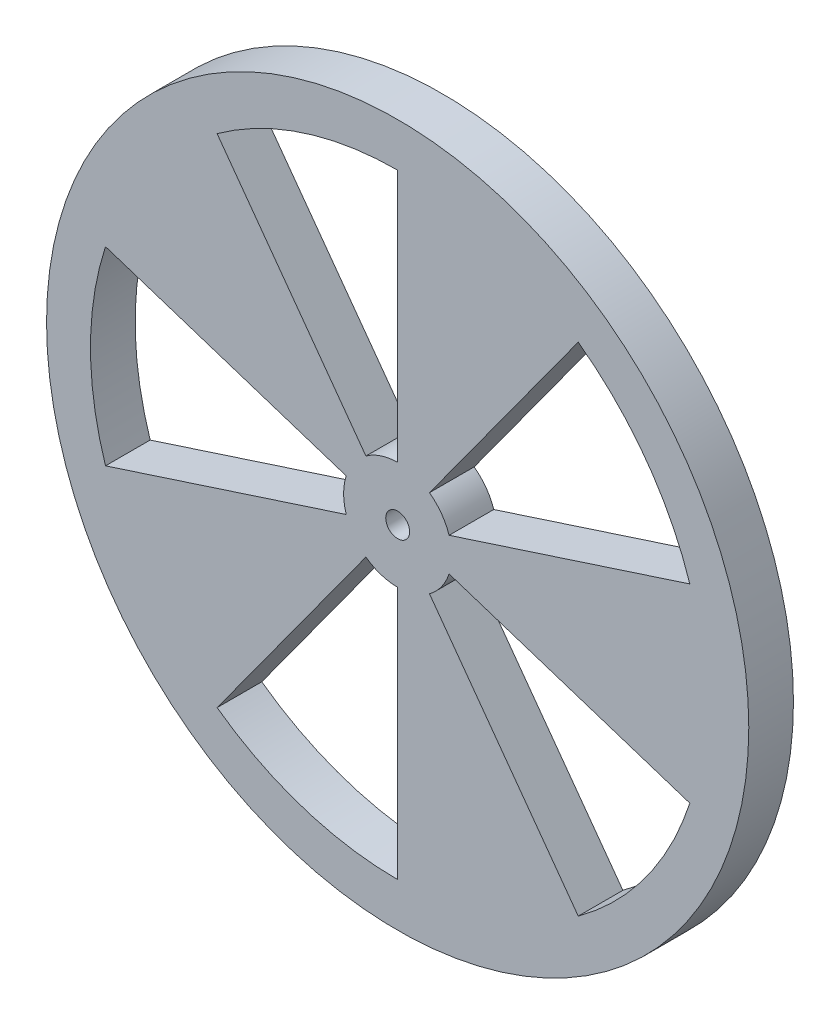
ISO-10303-21;
HEADER;
FILE_DESCRIPTION(('STEP AP214'),'2;1');
FILE_NAME('part.step','',(''),(''),'','','');
FILE_SCHEMA(('AUTOMOTIVE_DESIGN { 1 0 10303 214 1 1 1 1 }'));
ENDSEC;
DATA;
#1=APPLICATION_CONTEXT('core data for automotive mechanical design processes');
#2=APPLICATION_PROTOCOL_DEFINITION('international standard','automotive_design',2000,#1);
#3=PRODUCT_CONTEXT('',#1,'mechanical');
#4=PRODUCT('Part','Part','',(#3));
#5=PRODUCT_RELATED_PRODUCT_CATEGORY('part','',(#4));
#6=PRODUCT_DEFINITION_FORMATION('','',#4);
#7=PRODUCT_DEFINITION_CONTEXT('part definition',#1,'design');
#8=PRODUCT_DEFINITION('design','',#6,#7);
#9=PRODUCT_DEFINITION_SHAPE('','',#8);
#10=(LENGTH_UNIT() NAMED_UNIT(*) SI_UNIT(.MILLI.,.METRE.));
#11=(NAMED_UNIT(*) PLANE_ANGLE_UNIT() SI_UNIT($,.RADIAN.));
#12=(NAMED_UNIT(*) SI_UNIT($,.STERADIAN.) SOLID_ANGLE_UNIT());
#13=UNCERTAINTY_MEASURE_WITH_UNIT(LENGTH_MEASURE(1.E-05),#10,'distance_accuracy_value','');
#14=(GEOMETRIC_REPRESENTATION_CONTEXT(3) GLOBAL_UNCERTAINTY_ASSIGNED_CONTEXT((#13)) GLOBAL_UNIT_ASSIGNED_CONTEXT((#10,
#11,#12)) REPRESENTATION_CONTEXT('',''));
#15=CARTESIAN_POINT('',(0.,0.,0.));
#16=DIRECTION('',(0.,0.,1.));
#17=DIRECTION('',(1.,0.,0.));
#18=AXIS2_PLACEMENT_3D('',#15,#16,#17);
#19=CARTESIAN_POINT('',(0.,0.,3.18));
#20=DIRECTION('',(0.,0.,1.));
#21=DIRECTION('',(1.,0.,0.));
#22=AXIS2_PLACEMENT_3D('',#19,#20,#21);
#23=PLANE('',#22);
#24=DIRECTION('',(0.951056516295154,0.309016994374948,0.));
#25=VECTOR('',#24,1.);
#26=CARTESIAN_POINT('',(0.,0.,3.18));
#27=LINE('',#26,#25);
#28=CARTESIAN_POINT('',(3.66156758773635,1.18971542834355,3.18));
#29=VERTEX_POINT('',#28);
#30=CARTESIAN_POINT('',(20.8013341471714,6.75876317233811,3.18));
#31=VERTEX_POINT('',#30);
#32=EDGE_CURVE('E112',#29,#31,#27,.T.);
#33=ORIENTED_EDGE('',*,*,#32,.F.);
#34=CARTESIAN_POINT('',(0.,0.,3.18));
#35=DIRECTION('',(0.,0.,1.));
#36=DIRECTION('',(1.,0.,0.));
#37=AXIS2_PLACEMENT_3D('',#34,#35,#36);
#38=CIRCLE('',#37,3.85);
#39=CARTESIAN_POINT('',(2.26297322132602,3.11471542834354,3.18));
#40=VERTEX_POINT('',#39);
#41=EDGE_CURVE('E342',#29,#40,#38,.T.);
#42=ORIENTED_EDGE('',*,*,#41,.T.);
#43=DIRECTION('',(0.587785252292473,0.809016994374948,0.));
#44=VECTOR('',#43,1.);
#45=CARTESIAN_POINT('',(0.,0.,3.18));
#46=LINE('',#45,#44);
#47=CARTESIAN_POINT('',(12.8559315142957,17.6946717070922,3.18));
#48=VERTEX_POINT('',#47);
#49=EDGE_CURVE('E355',#40,#48,#46,.T.);
#50=ORIENTED_EDGE('',*,*,#49,.T.);
#51=CARTESIAN_POINT('',(0.,0.,3.18));
#52=DIRECTION('',(0.,0.,1.));
#53=DIRECTION('',(1.,0.,0.));
#54=AXIS2_PLACEMENT_3D('',#51,#52,#53);
#55=CIRCLE('',#54,21.8718170695083);
#56=EDGE_CURVE('E352',#31,#48,#55,.T.);
#57=ORIENTED_EDGE('',*,*,#56,.F.);
#58=EDGE_LOOP('',(#33,#42,#50,#57));
#59=FACE_BOUND('',#58,.T.);
#60=DIRECTION('',(0.587785252292473,-0.809016994374947,0.));
#61=VECTOR('',#60,1.);
#62=CARTESIAN_POINT('',(0.,0.,3.18));
#63=LINE('',#62,#61);
#64=CARTESIAN_POINT('',(2.26297322132602,-3.11471542834355,3.18));
#65=VERTEX_POINT('',#64);
#66=CARTESIAN_POINT('',(12.8559315142957,-17.6946717070922,3.18));
#67=VERTEX_POINT('',#66);
#68=EDGE_CURVE('E120',#65,#67,#63,.T.);
#69=ORIENTED_EDGE('',*,*,#68,.F.);
#70=CARTESIAN_POINT('',(0.,0.,3.18));
#71=DIRECTION('',(0.,0.,1.));
#72=DIRECTION('',(1.,0.,0.));
#73=AXIS2_PLACEMENT_3D('',#70,#71,#72);
#74=CIRCLE('',#73,3.85);
#75=CARTESIAN_POINT('',(3.66156758773634,-1.18971542834355,3.18));
#76=VERTEX_POINT('',#75);
#77=EDGE_CURVE('E313',#65,#76,#74,.T.);
#78=ORIENTED_EDGE('',*,*,#77,.T.);
#79=DIRECTION('',(0.951056516295154,-0.309016994374947,0.));
#80=VECTOR('',#79,1.);
#81=CARTESIAN_POINT('',(0.,0.,3.18));
#82=LINE('',#81,#80);
#83=CARTESIAN_POINT('',(20.8013341471714,-6.75876317233811,3.18));
#84=VERTEX_POINT('',#83);
#85=EDGE_CURVE('E327',#76,#84,#82,.T.);
#86=ORIENTED_EDGE('',*,*,#85,.T.);
#87=CARTESIAN_POINT('',(0.,0.,3.18));
#88=DIRECTION('',(0.,0.,1.));
#89=DIRECTION('',(1.,0.,0.));
#90=AXIS2_PLACEMENT_3D('',#87,#88,#89);
#91=CIRCLE('',#90,21.8718170695083);
#92=EDGE_CURVE('E323',#67,#84,#91,.T.);
#93=ORIENTED_EDGE('',*,*,#92,.F.);
#94=EDGE_LOOP('',(#69,#78,#86,#93));
#95=FACE_BOUND('',#94,.T.);
#96=DIRECTION('',(-0.951056516295154,0.309016994374947,0.));
#97=VECTOR('',#96,1.);
#98=CARTESIAN_POINT('',(0.,0.,3.18));
#99=LINE('',#98,#97);
#100=CARTESIAN_POINT('',(-3.66156758773635,1.18971542834355,3.18));
#101=VERTEX_POINT('',#100);
#102=CARTESIAN_POINT('',(-20.8013341471714,6.75876317233811,3.18));
#103=VERTEX_POINT('',#102);
#104=EDGE_CURVE('E274',#101,#103,#99,.T.);
#105=ORIENTED_EDGE('',*,*,#104,.F.);
#106=CARTESIAN_POINT('',(0.,0.,3.18));
#107=DIRECTION('',(0.,0.,1.));
#108=DIRECTION('',(1.,0.,0.));
#109=AXIS2_PLACEMENT_3D('',#106,#107,#108);
#110=CIRCLE('',#109,3.85);
#111=CARTESIAN_POINT('',(-3.66156758773634,-1.18971542834355,3.18));
#112=VERTEX_POINT('',#111);
#113=EDGE_CURVE('E282',#101,#112,#110,.T.);
#114=ORIENTED_EDGE('',*,*,#113,.T.);
#115=DIRECTION('',(-0.951056516295154,-0.309016994374948,0.));
#116=VECTOR('',#115,1.);
#117=CARTESIAN_POINT('',(0.,0.,3.18));
#118=LINE('',#117,#116);
#119=CARTESIAN_POINT('',(-20.8013341471714,-6.75876317233811,3.18));
#120=VERTEX_POINT('',#119);
#121=EDGE_CURVE('E295',#112,#120,#118,.T.);
#122=ORIENTED_EDGE('',*,*,#121,.T.);
#123=CARTESIAN_POINT('',(0.,0.,3.18));
#124=DIRECTION('',(0.,0.,1.));
#125=DIRECTION('',(1.,0.,0.));
#126=AXIS2_PLACEMENT_3D('',#123,#124,#125);
#127=CIRCLE('',#126,21.8718170695083);
#128=EDGE_CURVE('E292',#103,#120,#127,.T.);
#129=ORIENTED_EDGE('',*,*,#128,.F.);
#130=EDGE_LOOP('',(#105,#114,#122,#129));
#131=FACE_BOUND('',#130,.T.);
#132=DIRECTION('',(-0.587785252292473,-0.809016994374947,0.));
#133=VECTOR('',#132,1.);
#134=CARTESIAN_POINT('',(0.,0.,3.18));
#135=LINE('',#134,#133);
#136=CARTESIAN_POINT('',(-2.26297322132602,-3.11471542834355,3.18));
#137=VERTEX_POINT('',#136);
#138=CARTESIAN_POINT('',(-12.8559315142957,-17.6946717070922,3.18));
#139=VERTEX_POINT('',#138);
#140=EDGE_CURVE('E241',#137,#139,#135,.T.);
#141=ORIENTED_EDGE('',*,*,#140,.F.);
#142=CARTESIAN_POINT('',(0.,0.,3.18));
#143=DIRECTION('',(0.,0.,1.));
#144=DIRECTION('',(1.,0.,0.));
#145=AXIS2_PLACEMENT_3D('',#142,#143,#144);
#146=CIRCLE('',#145,3.85);
#147=CARTESIAN_POINT('',(0.,-3.85,3.18));
#148=VERTEX_POINT('',#147);
#149=EDGE_CURVE('E258',#137,#148,#146,.T.);
#150=ORIENTED_EDGE('',*,*,#149,.T.);
#151=DIRECTION('',(0.,-1.,0.));
#152=VECTOR('',#151,1.);
#153=CARTESIAN_POINT('',(0.,0.,3.18));
#154=LINE('',#153,#152);
#155=CARTESIAN_POINT('',(0.,-21.8718170695083,3.18));
#156=VERTEX_POINT('',#155);
#157=EDGE_CURVE('E261',#148,#156,#154,.T.);
#158=ORIENTED_EDGE('',*,*,#157,.T.);
#159=CARTESIAN_POINT('',(0.,0.,3.18));
#160=DIRECTION('',(0.,0.,1.));
#161=DIRECTION('',(1.,0.,0.));
#162=AXIS2_PLACEMENT_3D('',#159,#160,#161);
#163=CIRCLE('',#162,21.8718170695083);
#164=EDGE_CURVE('E267',#139,#156,#163,.T.);
#165=ORIENTED_EDGE('',*,*,#164,.F.);
#166=EDGE_LOOP('',(#141,#150,#158,#165));
#167=FACE_BOUND('',#166,.T.);
#168=DIRECTION('',(0.,1.,0.));
#169=VECTOR('',#168,1.);
#170=CARTESIAN_POINT('',(0.,0.,3.18));
#171=LINE('',#170,#169);
#172=CARTESIAN_POINT('',(0.,3.85,3.18));
#173=VERTEX_POINT('',#172);
#174=CARTESIAN_POINT('',(0.,21.8718170695083,3.18));
#175=VERTEX_POINT('',#174);
#176=EDGE_CURVE('E302',#173,#175,#171,.T.);
#177=ORIENTED_EDGE('',*,*,#176,.F.);
#178=CARTESIAN_POINT('',(0.,0.,3.18));
#179=DIRECTION('',(0.,0.,1.));
#180=DIRECTION('',(1.,0.,0.));
#181=AXIS2_PLACEMENT_3D('',#178,#179,#180);
#182=CIRCLE('',#181,3.85);
#183=CARTESIAN_POINT('',(-2.26297322132606,3.11471542834358,3.18));
#184=VERTEX_POINT('',#183);
#185=EDGE_CURVE('E370',#173,#184,#182,.T.);
#186=ORIENTED_EDGE('',*,*,#185,.T.);
#187=DIRECTION('',(-0.587785252292476,0.809016994374946,0.));
#188=VECTOR('',#187,1.);
#189=CARTESIAN_POINT('',(0.,0.,3.18));
#190=LINE('',#189,#188);
#191=CARTESIAN_POINT('',(-12.8559315142958,17.6946717070922,3.18));
#192=VERTEX_POINT('',#191);
#193=EDGE_CURVE('E383',#184,#192,#190,.T.);
#194=ORIENTED_EDGE('',*,*,#193,.T.);
#195=CARTESIAN_POINT('',(0.,0.,3.18));
#196=DIRECTION('',(0.,0.,1.));
#197=DIRECTION('',(1.,0.,0.));
#198=AXIS2_PLACEMENT_3D('',#195,#196,#197);
#199=CIRCLE('',#198,21.8718170695083);
#200=EDGE_CURVE('E380',#175,#192,#199,.T.);
#201=ORIENTED_EDGE('',*,*,#200,.F.);
#202=EDGE_LOOP('',(#177,#186,#194,#201));
#203=FACE_BOUND('',#202,.T.);
#204=CARTESIAN_POINT('',(0.,0.,3.18));
#205=DIRECTION('',(0.,0.,1.));
#206=DIRECTION('',(1.,0.,0.));
#207=AXIS2_PLACEMENT_3D('',#204,#205,#206);
#208=CIRCLE('',#207,25.);
#209=CARTESIAN_POINT('',(-25.,0.,3.18));
#210=VERTEX_POINT('',#209);
#211=EDGE_CURVE('E14',#210,#210,#208,.T.);
#212=ORIENTED_EDGE('',*,*,#211,.T.);
#213=EDGE_LOOP('',(#212));
#214=FACE_BOUND('',#213,.T.);
#215=CARTESIAN_POINT('',(0.,0.,3.18));
#216=DIRECTION('',(0.,0.,1.));
#217=DIRECTION('',(1.,0.,0.));
#218=AXIS2_PLACEMENT_3D('',#215,#216,#217);
#219=CIRCLE('',#218,0.85);
#220=CARTESIAN_POINT('',(-0.85,0.,3.18));
#221=VERTEX_POINT('',#220);
#222=EDGE_CURVE('E397',#221,#221,#219,.T.);
#223=ORIENTED_EDGE('',*,*,#222,.F.);
#224=EDGE_LOOP('',(#223));
#225=FACE_BOUND('',#224,.T.);
#226=ADVANCED_FACE('F97',(#59,#95,#131,#167,#203,#214,#225),#23,.T.);
#227=CARTESIAN_POINT('',(0.,0.,0.));
#228=DIRECTION('',(0.,0.,1.));
#229=DIRECTION('',(1.,0.,0.));
#230=AXIS2_PLACEMENT_3D('',#227,#228,#229);
#231=PLANE('',#230);
#232=CARTESIAN_POINT('',(0.,0.,0.));
#233=DIRECTION('',(0.,0.,1.));
#234=DIRECTION('',(1.,0.,0.));
#235=AXIS2_PLACEMENT_3D('',#232,#233,#234);
#236=CIRCLE('',#235,3.85);
#237=CARTESIAN_POINT('',(3.66156758773635,1.18971542834355,0.));
#238=VERTEX_POINT('',#237);
#239=CARTESIAN_POINT('',(2.26297322132602,3.11471542834354,0.));
#240=VERTEX_POINT('',#239);
#241=EDGE_CURVE('E348',#238,#240,#236,.T.);
#242=ORIENTED_EDGE('',*,*,#241,.F.);
#243=DIRECTION('',(0.951056516295154,0.309016994374948,0.));
#244=VECTOR('',#243,1.);
#245=CARTESIAN_POINT('',(0.,0.,0.));
#246=LINE('',#245,#244);
#247=CARTESIAN_POINT('',(20.8013341471714,6.75876317233811,0.));
#248=VERTEX_POINT('',#247);
#249=EDGE_CURVE('E338',#238,#248,#246,.T.);
#250=ORIENTED_EDGE('',*,*,#249,.T.);
#251=CARTESIAN_POINT('',(0.,0.,0.));
#252=DIRECTION('',(0.,0.,1.));
#253=DIRECTION('',(1.,0.,0.));
#254=AXIS2_PLACEMENT_3D('',#251,#252,#253);
#255=CIRCLE('',#254,21.8718170695083);
#256=CARTESIAN_POINT('',(12.8559315142957,17.6946717070922,0.));
#257=VERTEX_POINT('',#256);
#258=EDGE_CURVE('E341',#248,#257,#255,.T.);
#259=ORIENTED_EDGE('',*,*,#258,.T.);
#260=DIRECTION('',(0.587785252292473,0.809016994374948,0.));
#261=VECTOR('',#260,1.);
#262=CARTESIAN_POINT('',(0.,0.,0.));
#263=LINE('',#262,#261);
#264=EDGE_CURVE('E345',#240,#257,#263,.T.);
#265=ORIENTED_EDGE('',*,*,#264,.F.);
#266=EDGE_LOOP('',(#242,#250,#259,#265));
#267=FACE_BOUND('',#266,.T.);
#268=CARTESIAN_POINT('',(0.,0.,0.));
#269=DIRECTION('',(0.,0.,1.));
#270=DIRECTION('',(1.,0.,0.));
#271=AXIS2_PLACEMENT_3D('',#268,#269,#270);
#272=CIRCLE('',#271,3.85);
#273=CARTESIAN_POINT('',(2.26297322132602,-3.11471542834355,0.));
#274=VERTEX_POINT('',#273);
#275=CARTESIAN_POINT('',(3.66156758773634,-1.18971542834355,0.));
#276=VERTEX_POINT('',#275);
#277=EDGE_CURVE('E319',#274,#276,#272,.T.);
#278=ORIENTED_EDGE('',*,*,#277,.F.);
#279=DIRECTION('',(0.587785252292473,-0.809016994374947,0.));
#280=VECTOR('',#279,1.);
#281=CARTESIAN_POINT('',(0.,0.,0.));
#282=LINE('',#281,#280);
#283=CARTESIAN_POINT('',(12.8559315142957,-17.6946717070922,0.));
#284=VERTEX_POINT('',#283);
#285=EDGE_CURVE('E309',#274,#284,#282,.T.);
#286=ORIENTED_EDGE('',*,*,#285,.T.);
#287=CARTESIAN_POINT('',(0.,0.,0.));
#288=DIRECTION('',(0.,0.,1.));
#289=DIRECTION('',(1.,0.,0.));
#290=AXIS2_PLACEMENT_3D('',#287,#288,#289);
#291=CIRCLE('',#290,21.8718170695083);
#292=CARTESIAN_POINT('',(20.8013341471714,-6.75876317233811,0.));
#293=VERTEX_POINT('',#292);
#294=EDGE_CURVE('E312',#284,#293,#291,.T.);
#295=ORIENTED_EDGE('',*,*,#294,.T.);
#296=DIRECTION('',(0.951056516295154,-0.309016994374947,0.));
#297=VECTOR('',#296,1.);
#298=CARTESIAN_POINT('',(0.,0.,0.));
#299=LINE('',#298,#297);
#300=EDGE_CURVE('E316',#276,#293,#299,.T.);
#301=ORIENTED_EDGE('',*,*,#300,.F.);
#302=EDGE_LOOP('',(#278,#286,#295,#301));
#303=FACE_BOUND('',#302,.T.);
#304=CARTESIAN_POINT('',(0.,0.,0.));
#305=DIRECTION('',(0.,0.,1.));
#306=DIRECTION('',(1.,0.,0.));
#307=AXIS2_PLACEMENT_3D('',#304,#305,#306);
#308=CIRCLE('',#307,3.85);
#309=CARTESIAN_POINT('',(-3.66156758773635,1.18971542834355,0.));
#310=VERTEX_POINT('',#309);
#311=CARTESIAN_POINT('',(-3.66156758773634,-1.18971542834355,0.));
#312=VERTEX_POINT('',#311);
#313=EDGE_CURVE('E288',#310,#312,#308,.T.);
#314=ORIENTED_EDGE('',*,*,#313,.F.);
#315=DIRECTION('',(-0.951056516295154,0.309016994374947,0.));
#316=VECTOR('',#315,1.);
#317=CARTESIAN_POINT('',(0.,0.,0.));
#318=LINE('',#317,#316);
#319=CARTESIAN_POINT('',(-20.8013341471714,6.75876317233811,0.));
#320=VERTEX_POINT('',#319);
#321=EDGE_CURVE('E278',#310,#320,#318,.T.);
#322=ORIENTED_EDGE('',*,*,#321,.T.);
#323=CARTESIAN_POINT('',(0.,0.,0.));
#324=DIRECTION('',(0.,0.,1.));
#325=DIRECTION('',(1.,0.,0.));
#326=AXIS2_PLACEMENT_3D('',#323,#324,#325);
#327=CIRCLE('',#326,21.8718170695083);
#328=CARTESIAN_POINT('',(-20.8013341471714,-6.75876317233811,0.));
#329=VERTEX_POINT('',#328);
#330=EDGE_CURVE('E281',#320,#329,#327,.T.);
#331=ORIENTED_EDGE('',*,*,#330,.T.);
#332=DIRECTION('',(-0.951056516295154,-0.309016994374948,0.));
#333=VECTOR('',#332,1.);
#334=CARTESIAN_POINT('',(0.,0.,0.));
#335=LINE('',#334,#333);
#336=EDGE_CURVE('E285',#312,#329,#335,.T.);
#337=ORIENTED_EDGE('',*,*,#336,.F.);
#338=EDGE_LOOP('',(#314,#322,#331,#337));
#339=FACE_BOUND('',#338,.T.);
#340=CARTESIAN_POINT('',(0.,0.,0.));
#341=DIRECTION('',(0.,0.,1.));
#342=DIRECTION('',(1.,0.,0.));
#343=AXIS2_PLACEMENT_3D('',#340,#341,#342);
#344=CIRCLE('',#343,3.85);
#345=CARTESIAN_POINT('',(-2.26297322132602,-3.11471542834355,0.));
#346=VERTEX_POINT('',#345);
#347=CARTESIAN_POINT('',(0.,-3.85,0.));
#348=VERTEX_POINT('',#347);
#349=EDGE_CURVE('E246',#346,#348,#344,.T.);
#350=ORIENTED_EDGE('',*,*,#349,.F.);
#351=DIRECTION('',(-0.587785252292473,-0.809016994374947,0.));
#352=VECTOR('',#351,1.);
#353=CARTESIAN_POINT('',(0.,0.,0.));
#354=LINE('',#353,#352);
#355=CARTESIAN_POINT('',(-12.8559315142957,-17.6946717070922,0.));
#356=VERTEX_POINT('',#355);
#357=EDGE_CURVE('E238',#346,#356,#354,.T.);
#358=ORIENTED_EDGE('',*,*,#357,.T.);
#359=CARTESIAN_POINT('',(0.,0.,0.));
#360=DIRECTION('',(0.,0.,1.));
#361=DIRECTION('',(1.,0.,0.));
#362=AXIS2_PLACEMENT_3D('',#359,#360,#361);
#363=CIRCLE('',#362,21.8718170695083);
#364=CARTESIAN_POINT('',(0.,-21.8718170695083,0.));
#365=VERTEX_POINT('',#364);
#366=EDGE_CURVE('E249',#356,#365,#363,.T.);
#367=ORIENTED_EDGE('',*,*,#366,.T.);
#368=DIRECTION('',(0.,-1.,0.));
#369=VECTOR('',#368,1.);
#370=CARTESIAN_POINT('',(0.,0.,0.));
#371=LINE('',#370,#369);
#372=EDGE_CURVE('E254',#348,#365,#371,.T.);
#373=ORIENTED_EDGE('',*,*,#372,.F.);
#374=EDGE_LOOP('',(#350,#358,#367,#373));
#375=FACE_BOUND('',#374,.T.);
#376=CARTESIAN_POINT('',(0.,0.,0.));
#377=DIRECTION('',(0.,0.,1.));
#378=DIRECTION('',(1.,0.,0.));
#379=AXIS2_PLACEMENT_3D('',#376,#377,#378);
#380=CIRCLE('',#379,3.85);
#381=CARTESIAN_POINT('',(0.,3.85,0.));
#382=VERTEX_POINT('',#381);
#383=CARTESIAN_POINT('',(-2.26297322132606,3.11471542834358,0.));
#384=VERTEX_POINT('',#383);
#385=EDGE_CURVE('E376',#382,#384,#380,.T.);
#386=ORIENTED_EDGE('',*,*,#385,.F.);
#387=DIRECTION('',(0.,1.,0.));
#388=VECTOR('',#387,1.);
#389=CARTESIAN_POINT('',(0.,0.,0.));
#390=LINE('',#389,#388);
#391=CARTESIAN_POINT('',(0.,21.8718170695083,0.));
#392=VERTEX_POINT('',#391);
#393=EDGE_CURVE('E366',#382,#392,#390,.T.);
#394=ORIENTED_EDGE('',*,*,#393,.T.);
#395=CARTESIAN_POINT('',(0.,0.,0.));
#396=DIRECTION('',(0.,0.,1.));
#397=DIRECTION('',(1.,0.,0.));
#398=AXIS2_PLACEMENT_3D('',#395,#396,#397);
#399=CIRCLE('',#398,21.8718170695083);
#400=CARTESIAN_POINT('',(-12.8559315142958,17.6946717070922,0.));
#401=VERTEX_POINT('',#400);
#402=EDGE_CURVE('E369',#392,#401,#399,.T.);
#403=ORIENTED_EDGE('',*,*,#402,.T.);
#404=DIRECTION('',(-0.587785252292476,0.809016994374946,0.));
#405=VECTOR('',#404,1.);
#406=CARTESIAN_POINT('',(0.,0.,0.));
#407=LINE('',#406,#405);
#408=EDGE_CURVE('E373',#384,#401,#407,.T.);
#409=ORIENTED_EDGE('',*,*,#408,.F.);
#410=EDGE_LOOP('',(#386,#394,#403,#409));
#411=FACE_BOUND('',#410,.T.);
#412=CARTESIAN_POINT('',(0.,0.,0.));
#413=DIRECTION('',(0.,0.,1.));
#414=DIRECTION('',(1.,0.,0.));
#415=AXIS2_PLACEMENT_3D('',#412,#413,#414);
#416=CIRCLE('',#415,25.);
#417=CARTESIAN_POINT('',(-25.,0.,0.));
#418=VERTEX_POINT('',#417);
#419=EDGE_CURVE('E101',#418,#418,#416,.T.);
#420=ORIENTED_EDGE('',*,*,#419,.F.);
#421=EDGE_LOOP('',(#420));
#422=FACE_BOUND('',#421,.T.);
#423=CARTESIAN_POINT('',(0.,0.,0.));
#424=DIRECTION('',(0.,0.,1.));
#425=DIRECTION('',(1.,0.,0.));
#426=AXIS2_PLACEMENT_3D('',#423,#424,#425);
#427=CIRCLE('',#426,0.85);
#428=CARTESIAN_POINT('',(-0.85,0.,0.));
#429=VERTEX_POINT('',#428);
#430=EDGE_CURVE('E390',#429,#429,#427,.T.);
#431=ORIENTED_EDGE('',*,*,#430,.T.);
#432=EDGE_LOOP('',(#431));
#433=FACE_BOUND('',#432,.T.);
#434=ADVANCED_FACE('F256',(#267,#303,#339,#375,#411,#422,#433),#231,.F.);
#435=CARTESIAN_POINT('',(0.,0.,3.18));
#436=DIRECTION('',(0.,0.,-1.));
#437=DIRECTION('',(-1.,0.,0.));
#438=AXIS2_PLACEMENT_3D('',#435,#436,#437);
#439=CYLINDRICAL_SURFACE('',#438,25.);
#440=CARTESIAN_POINT('',(-25.,0.,3.18));
#441=CARTESIAN_POINT('',(-25.,0.,3.146875));
#442=CARTESIAN_POINT('',(-25.,0.,3.11375));
#443=CARTESIAN_POINT('',(-25.,0.,3.0475));
#444=CARTESIAN_POINT('',(-25.,0.,3.014375));
#445=CARTESIAN_POINT('',(-25.,0.,2.948125));
#446=CARTESIAN_POINT('',(-25.,0.,2.915));
#447=CARTESIAN_POINT('',(-25.,0.,2.84875));
#448=CARTESIAN_POINT('',(-25.,0.,2.815625));
#449=CARTESIAN_POINT('',(-25.,0.,2.749375));
#450=CARTESIAN_POINT('',(-25.,0.,2.71625));
#451=CARTESIAN_POINT('',(-25.,0.,2.65));
#452=CARTESIAN_POINT('',(-25.,0.,2.616875));
#453=CARTESIAN_POINT('',(-25.,0.,2.550625));
#454=CARTESIAN_POINT('',(-25.,0.,2.5175));
#455=CARTESIAN_POINT('',(-25.,0.,2.45125));
#456=CARTESIAN_POINT('',(-25.,0.,2.418125));
#457=CARTESIAN_POINT('',(-25.,0.,2.351875));
#458=CARTESIAN_POINT('',(-25.,0.,2.31875));
#459=CARTESIAN_POINT('',(-25.,0.,2.2525));
#460=CARTESIAN_POINT('',(-25.,0.,2.219375));
#461=CARTESIAN_POINT('',(-25.,0.,2.153125));
#462=CARTESIAN_POINT('',(-25.,0.,2.12));
#463=CARTESIAN_POINT('',(-25.,0.,2.05375));
#464=CARTESIAN_POINT('',(-25.,0.,2.020625));
#465=CARTESIAN_POINT('',(-25.,0.,1.954375));
#466=CARTESIAN_POINT('',(-25.,0.,1.92125));
#467=CARTESIAN_POINT('',(-25.,0.,1.855));
#468=CARTESIAN_POINT('',(-25.,0.,1.821875));
#469=CARTESIAN_POINT('',(-25.,0.,1.755625));
#470=CARTESIAN_POINT('',(-25.,0.,1.7225));
#471=CARTESIAN_POINT('',(-25.,0.,1.65625));
#472=CARTESIAN_POINT('',(-25.,0.,1.623125));
#473=CARTESIAN_POINT('',(-25.,0.,1.556875));
#474=CARTESIAN_POINT('',(-25.,0.,1.52375));
#475=CARTESIAN_POINT('',(-25.,0.,1.4575));
#476=CARTESIAN_POINT('',(-25.,0.,1.424375));
#477=CARTESIAN_POINT('',(-25.,0.,1.358125));
#478=CARTESIAN_POINT('',(-25.,0.,1.325));
#479=CARTESIAN_POINT('',(-25.,0.,1.25875));
#480=CARTESIAN_POINT('',(-25.,0.,1.225625));
#481=CARTESIAN_POINT('',(-25.,0.,1.159375));
#482=CARTESIAN_POINT('',(-25.,0.,1.12625));
#483=CARTESIAN_POINT('',(-25.,0.,1.06));
#484=CARTESIAN_POINT('',(-25.,0.,1.026875));
#485=CARTESIAN_POINT('',(-25.,0.,0.960625));
#486=CARTESIAN_POINT('',(-25.,0.,0.9275));
#487=CARTESIAN_POINT('',(-25.,0.,0.86125));
#488=CARTESIAN_POINT('',(-25.,0.,0.828125));
#489=CARTESIAN_POINT('',(-25.,0.,0.761875));
#490=CARTESIAN_POINT('',(-25.,0.,0.72875));
#491=CARTESIAN_POINT('',(-25.,0.,0.6625));
#492=CARTESIAN_POINT('',(-25.,0.,0.629375));
#493=CARTESIAN_POINT('',(-25.,0.,0.563125));
#494=CARTESIAN_POINT('',(-25.,0.,0.53));
#495=CARTESIAN_POINT('',(-25.,0.,0.46375));
#496=CARTESIAN_POINT('',(-25.,0.,0.430625));
#497=CARTESIAN_POINT('',(-25.,0.,0.364375));
#498=CARTESIAN_POINT('',(-25.,0.,0.33125));
#499=CARTESIAN_POINT('',(-25.,0.,0.265));
#500=CARTESIAN_POINT('',(-25.,0.,0.231875));
#501=CARTESIAN_POINT('',(-25.,0.,0.165625));
#502=CARTESIAN_POINT('',(-25.,0.,0.1325));
#503=CARTESIAN_POINT('',(-25.,0.,0.06625));
#504=CARTESIAN_POINT('',(-25.,0.,0.033125));
#505=CARTESIAN_POINT('',(-25.,0.,0.));
#506=B_SPLINE_CURVE_WITH_KNOTS('',3,(#440,#441,#442,#443,#444,#445,#446,#447,#448,#449,#450,
#451,#452,#453,#454,#455,#456,#457,#458,#459,#460,#461,#462,#463,#464,#465,#466,#467,#468,#469,
#470,#471,#472,#473,#474,#475,#476,#477,#478,#479,#480,#481,#482,#483,#484,#485,#486,#487,#488,
#489,#490,#491,#492,#493,#494,#495,#496,#497,#498,#499,#500,#501,#502,#503,#504,#505),
.UNSPECIFIED.,.F.,.F.,(4,2,2,2,2,2,2,2,2,2,2,2,2,2,2,2,2,2,2,2,2,2,2,2,2,2,2,2,2,2,2,2,4),(0.,
0.0993749999999996,0.19875,0.298125,0.3975,0.496875,0.59625,0.695625,0.795,0.894375,0.99375,
1.093125,1.1925,1.291875,1.39125,1.490625,1.59,1.689375,1.78875,1.888125,1.9875,2.086875,
2.18625,2.285625,2.385,2.484375,2.58375,2.683125,2.7825,2.881875,2.98125,3.080625,3.18),.UNSPECIFIED.);
#507=EDGE_CURVE('BSEAM99',#210,#418,#506,.T.);
#508=ORIENTED_EDGE('',*,*,#211,.F.);
#509=ORIENTED_EDGE('',*,*,#419,.T.);
#510=ORIENTED_EDGE('',*,*,#507,.T.);
#511=ORIENTED_EDGE('',*,*,#507,.F.);
#512=EDGE_LOOP('',(#508,#510,#509,#511));
#513=FACE_BOUND('',#512,.T.);
#514=ADVANCED_FACE('F99',(#513),#439,.T.);
#515=CARTESIAN_POINT('',(0.,0.,3.18));
#516=DIRECTION('',(0.,0.,-1.));
#517=DIRECTION('',(-1.,0.,0.));
#518=AXIS2_PLACEMENT_3D('',#515,#516,#517);
#519=CYLINDRICAL_SURFACE('',#518,0.85);
#520=CARTESIAN_POINT('',(-0.85,0.,3.18));
#521=CARTESIAN_POINT('',(-0.85,0.,3.146875));
#522=CARTESIAN_POINT('',(-0.85,0.,3.11375));
#523=CARTESIAN_POINT('',(-0.85,0.,3.0475));
#524=CARTESIAN_POINT('',(-0.85,0.,3.014375));
#525=CARTESIAN_POINT('',(-0.85,0.,2.948125));
#526=CARTESIAN_POINT('',(-0.85,0.,2.915));
#527=CARTESIAN_POINT('',(-0.85,0.,2.84875));
#528=CARTESIAN_POINT('',(-0.85,0.,2.815625));
#529=CARTESIAN_POINT('',(-0.85,0.,2.749375));
#530=CARTESIAN_POINT('',(-0.85,0.,2.71625));
#531=CARTESIAN_POINT('',(-0.85,0.,2.65));
#532=CARTESIAN_POINT('',(-0.85,0.,2.616875));
#533=CARTESIAN_POINT('',(-0.85,0.,2.550625));
#534=CARTESIAN_POINT('',(-0.85,0.,2.5175));
#535=CARTESIAN_POINT('',(-0.85,0.,2.45125));
#536=CARTESIAN_POINT('',(-0.85,0.,2.418125));
#537=CARTESIAN_POINT('',(-0.85,0.,2.351875));
#538=CARTESIAN_POINT('',(-0.85,0.,2.31875));
#539=CARTESIAN_POINT('',(-0.85,0.,2.2525));
#540=CARTESIAN_POINT('',(-0.85,0.,2.219375));
#541=CARTESIAN_POINT('',(-0.85,0.,2.153125));
#542=CARTESIAN_POINT('',(-0.85,0.,2.12));
#543=CARTESIAN_POINT('',(-0.85,0.,2.05375));
#544=CARTESIAN_POINT('',(-0.85,0.,2.020625));
#545=CARTESIAN_POINT('',(-0.85,0.,1.954375));
#546=CARTESIAN_POINT('',(-0.85,0.,1.92125));
#547=CARTESIAN_POINT('',(-0.85,0.,1.855));
#548=CARTESIAN_POINT('',(-0.85,0.,1.821875));
#549=CARTESIAN_POINT('',(-0.85,0.,1.755625));
#550=CARTESIAN_POINT('',(-0.85,0.,1.7225));
#551=CARTESIAN_POINT('',(-0.85,0.,1.65625));
#552=CARTESIAN_POINT('',(-0.85,0.,1.623125));
#553=CARTESIAN_POINT('',(-0.85,0.,1.556875));
#554=CARTESIAN_POINT('',(-0.85,0.,1.52375));
#555=CARTESIAN_POINT('',(-0.85,0.,1.4575));
#556=CARTESIAN_POINT('',(-0.85,0.,1.424375));
#557=CARTESIAN_POINT('',(-0.85,0.,1.358125));
#558=CARTESIAN_POINT('',(-0.85,0.,1.325));
#559=CARTESIAN_POINT('',(-0.85,0.,1.25875));
#560=CARTESIAN_POINT('',(-0.85,0.,1.225625));
#561=CARTESIAN_POINT('',(-0.85,0.,1.159375));
#562=CARTESIAN_POINT('',(-0.85,0.,1.12625));
#563=CARTESIAN_POINT('',(-0.85,0.,1.06));
#564=CARTESIAN_POINT('',(-0.85,0.,1.026875));
#565=CARTESIAN_POINT('',(-0.85,0.,0.960625));
#566=CARTESIAN_POINT('',(-0.85,0.,0.9275));
#567=CARTESIAN_POINT('',(-0.85,0.,0.86125));
#568=CARTESIAN_POINT('',(-0.85,0.,0.828125));
#569=CARTESIAN_POINT('',(-0.85,0.,0.761875));
#570=CARTESIAN_POINT('',(-0.85,0.,0.72875));
#571=CARTESIAN_POINT('',(-0.85,0.,0.6625));
#572=CARTESIAN_POINT('',(-0.85,0.,0.629375));
#573=CARTESIAN_POINT('',(-0.85,0.,0.563125));
#574=CARTESIAN_POINT('',(-0.85,0.,0.53));
#575=CARTESIAN_POINT('',(-0.85,0.,0.46375));
#576=CARTESIAN_POINT('',(-0.85,0.,0.430625));
#577=CARTESIAN_POINT('',(-0.85,0.,0.364375));
#578=CARTESIAN_POINT('',(-0.85,0.,0.33125));
#579=CARTESIAN_POINT('',(-0.85,0.,0.265));
#580=CARTESIAN_POINT('',(-0.85,0.,0.231875));
#581=CARTESIAN_POINT('',(-0.85,0.,0.165625));
#582=CARTESIAN_POINT('',(-0.85,0.,0.1325));
#583=CARTESIAN_POINT('',(-0.85,0.,0.06625));
#584=CARTESIAN_POINT('',(-0.85,0.,0.033125));
#585=CARTESIAN_POINT('',(-0.85,0.,0.));
#586=B_SPLINE_CURVE_WITH_KNOTS('',3,(#520,#521,#522,#523,#524,#525,#526,#527,#528,#529,#530,
#531,#532,#533,#534,#535,#536,#537,#538,#539,#540,#541,#542,#543,#544,#545,#546,#547,#548,#549,
#550,#551,#552,#553,#554,#555,#556,#557,#558,#559,#560,#561,#562,#563,#564,#565,#566,#567,#568,
#569,#570,#571,#572,#573,#574,#575,#576,#577,#578,#579,#580,#581,#582,#583,#584,#585),
.UNSPECIFIED.,.F.,.F.,(4,2,2,2,2,2,2,2,2,2,2,2,2,2,2,2,2,2,2,2,2,2,2,2,2,2,2,2,2,2,2,2,4),(0.,
0.0993750000000001,0.19875,0.298125,0.3975,0.496875,0.59625,0.695625,0.795,0.894375,0.99375,
1.093125,1.1925,1.291875,1.39125,1.490625,1.59,1.689375,1.78875,1.888125,1.9875,2.086875,
2.18625,2.285625,2.385,2.484375,2.58375,2.683125,2.7825,2.881875,2.98125,3.080625,3.18),.UNSPECIFIED.);
#587=EDGE_CURVE('BSEAM404',#221,#429,#586,.T.);
#588=ORIENTED_EDGE('',*,*,#222,.T.);
#589=ORIENTED_EDGE('',*,*,#430,.F.);
#590=ORIENTED_EDGE('',*,*,#587,.T.);
#591=ORIENTED_EDGE('',*,*,#587,.F.);
#592=EDGE_LOOP('',(#588,#590,#589,#591));
#593=FACE_BOUND('',#592,.T.);
#594=ADVANCED_FACE('F404',(#593),#519,.F.);
#595=CARTESIAN_POINT('',(0.,0.,0.));
#596=DIRECTION('',(1.,0.,0.));
#597=DIRECTION('',(0.,0.,-1.));
#598=AXIS2_PLACEMENT_3D('',#595,#596,#597);
#599=PLANE('',#598);
#600=ORIENTED_EDGE('',*,*,#176,.T.);
#601=DIRECTION('',(0.,0.,1.));
#602=VECTOR('',#601,1.);
#603=CARTESIAN_POINT('',(0.,21.8718170695083,0.));
#604=LINE('',#603,#602);
#605=EDGE_CURVE('E378',#392,#175,#604,.T.);
#606=ORIENTED_EDGE('',*,*,#605,.F.);
#607=ORIENTED_EDGE('',*,*,#393,.F.);
#608=DIRECTION('',(0.,0.,1.));
#609=VECTOR('',#608,1.);
#610=CARTESIAN_POINT('',(0.,3.85,0.));
#611=LINE('',#610,#609);
#612=EDGE_CURVE('E388',#382,#173,#611,.T.);
#613=ORIENTED_EDGE('',*,*,#612,.T.);
#614=EDGE_LOOP('',(#600,#606,#607,#613));
#615=FACE_BOUND('',#614,.T.);
#616=ADVANCED_FACE('F406',(#615),#599,.F.);
#617=CARTESIAN_POINT('',(0.,0.,0.));
#618=DIRECTION('',(0.,0.,1.));
#619=DIRECTION('',(1.,0.,0.));
#620=AXIS2_PLACEMENT_3D('',#617,#618,#619);
#621=CYLINDRICAL_SURFACE('',#620,3.85);
#622=ORIENTED_EDGE('',*,*,#185,.F.);
#623=ORIENTED_EDGE('',*,*,#612,.F.);
#624=ORIENTED_EDGE('',*,*,#385,.T.);
#625=DIRECTION('',(0.,0.,1.));
#626=VECTOR('',#625,1.);
#627=CARTESIAN_POINT('',(-2.26297322132606,3.11471542834358,0.));
#628=LINE('',#627,#626);
#629=EDGE_CURVE('E391',#384,#184,#628,.T.);
#630=ORIENTED_EDGE('',*,*,#629,.T.);
#631=EDGE_LOOP('',(#622,#623,#624,#630));
#632=FACE_BOUND('',#631,.T.);
#633=ADVANCED_FACE('F413',(#632),#621,.T.);
#634=CARTESIAN_POINT('',(0.,0.,0.));
#635=DIRECTION('',(0.809016994374946,0.587785252292476,0.));
#636=DIRECTION('',(-0.587785252292476,0.809016994374946,0.));
#637=AXIS2_PLACEMENT_3D('',#634,#635,#636);
#638=PLANE('',#637);
#639=ORIENTED_EDGE('',*,*,#193,.F.);
#640=ORIENTED_EDGE('',*,*,#629,.F.);
#641=ORIENTED_EDGE('',*,*,#408,.T.);
#642=DIRECTION('',(0.,0.,1.));
#643=VECTOR('',#642,1.);
#644=CARTESIAN_POINT('',(-12.8559315142958,17.6946717070922,0.));
#645=LINE('',#644,#643);
#646=EDGE_CURVE('E393',#401,#192,#645,.T.);
#647=ORIENTED_EDGE('',*,*,#646,.T.);
#648=EDGE_LOOP('',(#639,#640,#641,#647));
#649=FACE_BOUND('',#648,.T.);
#650=ADVANCED_FACE('F453',(#649),#638,.T.);
#651=CARTESIAN_POINT('',(0.,0.,0.));
#652=DIRECTION('',(0.,0.,1.));
#653=DIRECTION('',(1.,0.,0.));
#654=AXIS2_PLACEMENT_3D('',#651,#652,#653);
#655=CYLINDRICAL_SURFACE('',#654,21.8718170695083);
#656=ORIENTED_EDGE('',*,*,#200,.T.);
#657=ORIENTED_EDGE('',*,*,#646,.F.);
#658=ORIENTED_EDGE('',*,*,#402,.F.);
#659=ORIENTED_EDGE('',*,*,#605,.T.);
#660=EDGE_LOOP('',(#656,#657,#658,#659));
#661=FACE_BOUND('',#660,.T.);
#662=ADVANCED_FACE('F446',(#661),#655,.F.);
#663=CARTESIAN_POINT('',(0.,0.,0.));
#664=DIRECTION('',(-0.809016994374947,0.587785252292473,0.));
#665=DIRECTION('',(-0.587785252292473,-0.809016994374948,0.));
#666=AXIS2_PLACEMENT_3D('',#663,#664,#665);
#667=PLANE('',#666);
#668=ORIENTED_EDGE('',*,*,#140,.T.);
#669=DIRECTION('',(0.,0.,1.));
#670=VECTOR('',#669,1.);
#671=CARTESIAN_POINT('',(-12.8559315142957,-17.6946717070922,0.));
#672=LINE('',#671,#670);
#673=EDGE_CURVE('E234',#356,#139,#672,.T.);
#674=ORIENTED_EDGE('',*,*,#673,.F.);
#675=ORIENTED_EDGE('',*,*,#357,.F.);
#676=DIRECTION('',(0.,0.,1.));
#677=VECTOR('',#676,1.);
#678=CARTESIAN_POINT('',(-2.26297322132602,-3.11471542834355,0.));
#679=LINE('',#678,#677);
#680=EDGE_CURVE('E272',#346,#137,#679,.T.);
#681=ORIENTED_EDGE('',*,*,#680,.T.);
#682=EDGE_LOOP('',(#668,#674,#675,#681));
#683=FACE_BOUND('',#682,.T.);
#684=ADVANCED_FACE('F236',(#683),#667,.F.);
#685=CARTESIAN_POINT('',(0.,0.,0.));
#686=DIRECTION('',(0.,0.,1.));
#687=DIRECTION('',(1.,0.,0.));
#688=AXIS2_PLACEMENT_3D('',#685,#686,#687);
#689=CYLINDRICAL_SURFACE('',#688,3.85);
#690=ORIENTED_EDGE('',*,*,#149,.F.);
#691=ORIENTED_EDGE('',*,*,#680,.F.);
#692=ORIENTED_EDGE('',*,*,#349,.T.);
#693=DIRECTION('',(0.,0.,1.));
#694=VECTOR('',#693,1.);
#695=CARTESIAN_POINT('',(0.,-3.85,0.));
#696=LINE('',#695,#694);
#697=EDGE_CURVE('E275',#348,#148,#696,.T.);
#698=ORIENTED_EDGE('',*,*,#697,.T.);
#699=EDGE_LOOP('',(#690,#691,#692,#698));
#700=FACE_BOUND('',#699,.T.);
#701=ADVANCED_FACE('F511',(#700),#689,.T.);
#702=CARTESIAN_POINT('',(0.,0.,0.));
#703=DIRECTION('',(-1.,0.,0.));
#704=DIRECTION('',(0.,-1.,0.));
#705=AXIS2_PLACEMENT_3D('',#702,#703,#704);
#706=PLANE('',#705);
#707=ORIENTED_EDGE('',*,*,#157,.F.);
#708=ORIENTED_EDGE('',*,*,#697,.F.);
#709=ORIENTED_EDGE('',*,*,#372,.T.);
#710=DIRECTION('',(0.,0.,1.));
#711=VECTOR('',#710,1.);
#712=CARTESIAN_POINT('',(0.,-21.8718170695083,0.));
#713=LINE('',#712,#711);
#714=EDGE_CURVE('E245',#365,#156,#713,.T.);
#715=ORIENTED_EDGE('',*,*,#714,.T.);
#716=EDGE_LOOP('',(#707,#708,#709,#715));
#717=FACE_BOUND('',#716,.T.);
#718=ADVANCED_FACE('F514',(#717),#706,.T.);
#719=CARTESIAN_POINT('',(0.,0.,0.));
#720=DIRECTION('',(0.,0.,1.));
#721=DIRECTION('',(1.,0.,0.));
#722=AXIS2_PLACEMENT_3D('',#719,#720,#721);
#723=CYLINDRICAL_SURFACE('',#722,21.8718170695083);
#724=ORIENTED_EDGE('',*,*,#164,.T.);
#725=ORIENTED_EDGE('',*,*,#714,.F.);
#726=ORIENTED_EDGE('',*,*,#366,.F.);
#727=ORIENTED_EDGE('',*,*,#673,.T.);
#728=EDGE_LOOP('',(#724,#725,#726,#727));
#729=FACE_BOUND('',#728,.T.);
#730=ADVANCED_FACE('F250',(#729),#723,.F.);
#731=CARTESIAN_POINT('',(0.,0.,0.));
#732=DIRECTION('',(0.309016994374947,0.951056516295154,0.));
#733=DIRECTION('',(-0.951056516295154,0.309016994374947,0.));
#734=AXIS2_PLACEMENT_3D('',#731,#732,#733);
#735=PLANE('',#734);
#736=ORIENTED_EDGE('',*,*,#104,.T.);
#737=DIRECTION('',(0.,0.,1.));
#738=VECTOR('',#737,1.);
#739=CARTESIAN_POINT('',(-20.8013341471714,6.75876317233811,0.));
#740=LINE('',#739,#738);
#741=EDGE_CURVE('E290',#320,#103,#740,.T.);
#742=ORIENTED_EDGE('',*,*,#741,.F.);
#743=ORIENTED_EDGE('',*,*,#321,.F.);
#744=DIRECTION('',(0.,0.,1.));
#745=VECTOR('',#744,1.);
#746=CARTESIAN_POINT('',(-3.66156758773635,1.18971542834355,0.));
#747=LINE('',#746,#745);
#748=EDGE_CURVE('E300',#310,#101,#747,.T.);
#749=ORIENTED_EDGE('',*,*,#748,.T.);
#750=EDGE_LOOP('',(#736,#742,#743,#749));
#751=FACE_BOUND('',#750,.T.);
#752=ADVANCED_FACE('F494',(#751),#735,.F.);
#753=CARTESIAN_POINT('',(0.,0.,0.));
#754=DIRECTION('',(0.,0.,1.));
#755=DIRECTION('',(1.,0.,0.));
#756=AXIS2_PLACEMENT_3D('',#753,#754,#755);
#757=CYLINDRICAL_SURFACE('',#756,3.85);
#758=ORIENTED_EDGE('',*,*,#113,.F.);
#759=ORIENTED_EDGE('',*,*,#748,.F.);
#760=ORIENTED_EDGE('',*,*,#313,.T.);
#761=DIRECTION('',(0.,0.,1.));
#762=VECTOR('',#761,1.);
#763=CARTESIAN_POINT('',(-3.66156758773634,-1.18971542834355,0.));
#764=LINE('',#763,#762);
#765=EDGE_CURVE('E303',#312,#112,#764,.T.);
#766=ORIENTED_EDGE('',*,*,#765,.T.);
#767=EDGE_LOOP('',(#758,#759,#760,#766));
#768=FACE_BOUND('',#767,.T.);
#769=ADVANCED_FACE('F497',(#768),#757,.T.);
#770=CARTESIAN_POINT('',(0.,0.,0.));
#771=DIRECTION('',(-0.309016994374948,0.951056516295153,0.));
#772=DIRECTION('',(-0.951056516295154,-0.309016994374948,0.));
#773=AXIS2_PLACEMENT_3D('',#770,#771,#772);
#774=PLANE('',#773);
#775=ORIENTED_EDGE('',*,*,#121,.F.);
#776=ORIENTED_EDGE('',*,*,#765,.F.);
#777=ORIENTED_EDGE('',*,*,#336,.T.);
#778=DIRECTION('',(0.,0.,1.));
#779=VECTOR('',#778,1.);
#780=CARTESIAN_POINT('',(-20.8013341471714,-6.75876317233811,0.));
#781=LINE('',#780,#779);
#782=EDGE_CURVE('E305',#329,#120,#781,.T.);
#783=ORIENTED_EDGE('',*,*,#782,.T.);
#784=EDGE_LOOP('',(#775,#776,#777,#783));
#785=FACE_BOUND('',#784,.T.);
#786=ADVANCED_FACE('F501',(#785),#774,.T.);
#787=CARTESIAN_POINT('',(0.,0.,0.));
#788=DIRECTION('',(0.,0.,1.));
#789=DIRECTION('',(1.,0.,0.));
#790=AXIS2_PLACEMENT_3D('',#787,#788,#789);
#791=CYLINDRICAL_SURFACE('',#790,21.8718170695083);
#792=ORIENTED_EDGE('',*,*,#128,.T.);
#793=ORIENTED_EDGE('',*,*,#782,.F.);
#794=ORIENTED_EDGE('',*,*,#330,.F.);
#795=ORIENTED_EDGE('',*,*,#741,.T.);
#796=EDGE_LOOP('',(#792,#793,#794,#795));
#797=FACE_BOUND('',#796,.T.);
#798=ADVANCED_FACE('F483',(#797),#791,.F.);
#799=CARTESIAN_POINT('',(0.,0.,0.));
#800=DIRECTION('',(-0.809016994374947,-0.587785252292473,0.));
#801=DIRECTION('',(0.587785252292473,-0.809016994374947,0.));
#802=AXIS2_PLACEMENT_3D('',#799,#800,#801);
#803=PLANE('',#802);
#804=ORIENTED_EDGE('',*,*,#68,.T.);
#805=DIRECTION('',(0.,0.,1.));
#806=VECTOR('',#805,1.);
#807=CARTESIAN_POINT('',(12.8559315142957,-17.6946717070922,0.));
#808=LINE('',#807,#806);
#809=EDGE_CURVE('E321',#284,#67,#808,.T.);
#810=ORIENTED_EDGE('',*,*,#809,.F.);
#811=ORIENTED_EDGE('',*,*,#285,.F.);
#812=DIRECTION('',(0.,0.,1.));
#813=VECTOR('',#812,1.);
#814=CARTESIAN_POINT('',(2.26297322132602,-3.11471542834355,0.));
#815=LINE('',#814,#813);
#816=EDGE_CURVE('E268',#274,#65,#815,.T.);
#817=ORIENTED_EDGE('',*,*,#816,.T.);
#818=EDGE_LOOP('',(#804,#810,#811,#817));
#819=FACE_BOUND('',#818,.T.);
#820=ADVANCED_FACE('F479',(#819),#803,.F.);
#821=CARTESIAN_POINT('',(0.,0.,0.));
#822=DIRECTION('',(0.,0.,1.));
#823=DIRECTION('',(1.,0.,0.));
#824=AXIS2_PLACEMENT_3D('',#821,#822,#823);
#825=CYLINDRICAL_SURFACE('',#824,3.85);
#826=ORIENTED_EDGE('',*,*,#77,.F.);
#827=ORIENTED_EDGE('',*,*,#816,.F.);
#828=ORIENTED_EDGE('',*,*,#277,.T.);
#829=DIRECTION('',(0.,0.,1.));
#830=VECTOR('',#829,1.);
#831=CARTESIAN_POINT('',(3.66156758773634,-1.18971542834355,0.));
#832=LINE('',#831,#830);
#833=EDGE_CURVE('E333',#276,#76,#832,.T.);
#834=ORIENTED_EDGE('',*,*,#833,.T.);
#835=EDGE_LOOP('',(#826,#827,#828,#834));
#836=FACE_BOUND('',#835,.T.);
#837=ADVANCED_FACE('F482',(#836),#825,.T.);
#838=CARTESIAN_POINT('',(0.,0.,0.));
#839=DIRECTION('',(-0.309016994374947,-0.951056516295154,0.));
#840=DIRECTION('',(0.951056516295154,-0.309016994374947,0.));
#841=AXIS2_PLACEMENT_3D('',#838,#839,#840);
#842=PLANE('',#841);
#843=ORIENTED_EDGE('',*,*,#85,.F.);
#844=ORIENTED_EDGE('',*,*,#833,.F.);
#845=ORIENTED_EDGE('',*,*,#300,.T.);
#846=DIRECTION('',(0.,0.,1.));
#847=VECTOR('',#846,1.);
#848=CARTESIAN_POINT('',(20.8013341471714,-6.75876317233811,0.));
#849=LINE('',#848,#847);
#850=EDGE_CURVE('E335',#293,#84,#849,.T.);
#851=ORIENTED_EDGE('',*,*,#850,.T.);
#852=EDGE_LOOP('',(#843,#844,#845,#851));
#853=FACE_BOUND('',#852,.T.);
#854=ADVANCED_FACE('F486',(#853),#842,.T.);
#855=CARTESIAN_POINT('',(0.,0.,0.));
#856=DIRECTION('',(0.,0.,1.));
#857=DIRECTION('',(1.,0.,0.));
#858=AXIS2_PLACEMENT_3D('',#855,#856,#857);
#859=CYLINDRICAL_SURFACE('',#858,21.8718170695083);
#860=ORIENTED_EDGE('',*,*,#92,.T.);
#861=ORIENTED_EDGE('',*,*,#850,.F.);
#862=ORIENTED_EDGE('',*,*,#294,.F.);
#863=ORIENTED_EDGE('',*,*,#809,.T.);
#864=EDGE_LOOP('',(#860,#861,#862,#863));
#865=FACE_BOUND('',#864,.T.);
#866=ADVANCED_FACE('F467',(#865),#859,.F.);
#867=CARTESIAN_POINT('',(0.,0.,0.));
#868=DIRECTION('',(0.309016994374947,-0.951056516295154,0.));
#869=DIRECTION('',(0.951056516295154,0.309016994374948,0.));
#870=AXIS2_PLACEMENT_3D('',#867,#868,#869);
#871=PLANE('',#870);
#872=ORIENTED_EDGE('',*,*,#32,.T.);
#873=DIRECTION('',(0.,0.,1.));
#874=VECTOR('',#873,1.);
#875=CARTESIAN_POINT('',(20.8013341471714,6.75876317233811,0.));
#876=LINE('',#875,#874);
#877=EDGE_CURVE('E350',#248,#31,#876,.T.);
#878=ORIENTED_EDGE('',*,*,#877,.F.);
#879=ORIENTED_EDGE('',*,*,#249,.F.);
#880=DIRECTION('',(0.,0.,1.));
#881=VECTOR('',#880,1.);
#882=CARTESIAN_POINT('',(3.66156758773635,1.18971542834355,0.));
#883=LINE('',#882,#881);
#884=EDGE_CURVE('E324',#238,#29,#883,.T.);
#885=ORIENTED_EDGE('',*,*,#884,.T.);
#886=EDGE_LOOP('',(#872,#878,#879,#885));
#887=FACE_BOUND('',#886,.T.);
#888=ADVANCED_FACE('F463',(#887),#871,.F.);
#889=CARTESIAN_POINT('',(0.,0.,0.));
#890=DIRECTION('',(0.,0.,1.));
#891=DIRECTION('',(1.,0.,0.));
#892=AXIS2_PLACEMENT_3D('',#889,#890,#891);
#893=CYLINDRICAL_SURFACE('',#892,3.85);
#894=ORIENTED_EDGE('',*,*,#41,.F.);
#895=ORIENTED_EDGE('',*,*,#884,.F.);
#896=ORIENTED_EDGE('',*,*,#241,.T.);
#897=DIRECTION('',(0.,0.,1.));
#898=VECTOR('',#897,1.);
#899=CARTESIAN_POINT('',(2.26297322132602,3.11471542834354,0.));
#900=LINE('',#899,#898);
#901=EDGE_CURVE('E361',#240,#40,#900,.T.);
#902=ORIENTED_EDGE('',*,*,#901,.T.);
#903=EDGE_LOOP('',(#894,#895,#896,#902));
#904=FACE_BOUND('',#903,.T.);
#905=ADVANCED_FACE('F466',(#904),#893,.T.);
#906=CARTESIAN_POINT('',(0.,0.,0.));
#907=DIRECTION('',(0.809016994374947,-0.587785252292473,0.));
#908=DIRECTION('',(0.587785252292473,0.809016994374948,0.));
#909=AXIS2_PLACEMENT_3D('',#906,#907,#908);
#910=PLANE('',#909);
#911=ORIENTED_EDGE('',*,*,#49,.F.);
#912=ORIENTED_EDGE('',*,*,#901,.F.);
#913=ORIENTED_EDGE('',*,*,#264,.T.);
#914=DIRECTION('',(0.,0.,1.));
#915=VECTOR('',#914,1.);
#916=CARTESIAN_POINT('',(12.8559315142957,17.6946717070922,0.));
#917=LINE('',#916,#915);
#918=EDGE_CURVE('E363',#257,#48,#917,.T.);
#919=ORIENTED_EDGE('',*,*,#918,.T.);
#920=EDGE_LOOP('',(#911,#912,#913,#919));
#921=FACE_BOUND('',#920,.T.);
#922=ADVANCED_FACE('F471',(#921),#910,.T.);
#923=CARTESIAN_POINT('',(0.,0.,0.));
#924=DIRECTION('',(0.,0.,1.));
#925=DIRECTION('',(1.,0.,0.));
#926=AXIS2_PLACEMENT_3D('',#923,#924,#925);
#927=CYLINDRICAL_SURFACE('',#926,21.8718170695083);
#928=ORIENTED_EDGE('',*,*,#56,.T.);
#929=ORIENTED_EDGE('',*,*,#918,.F.);
#930=ORIENTED_EDGE('',*,*,#258,.F.);
#931=ORIENTED_EDGE('',*,*,#877,.T.);
#932=EDGE_LOOP('',(#928,#929,#930,#931));
#933=FACE_BOUND('',#932,.T.);
#934=ADVANCED_FACE('F468',(#933),#927,.F.);
#935=CLOSED_SHELL('',(#226,#434,#514,#594,#616,#633,#650,#662,#684,#701,#718,#730,#752,#769,
#786,#798,#820,#837,#854,#866,#888,#905,#922,#934));
#936=MANIFOLD_SOLID_BREP('B2',#935);
#937=ADVANCED_BREP_SHAPE_REPRESENTATION('',(#18,#936),#14);
#938=SHAPE_DEFINITION_REPRESENTATION(#9,#937);
ENDSEC;
END-ISO-10303-21;
